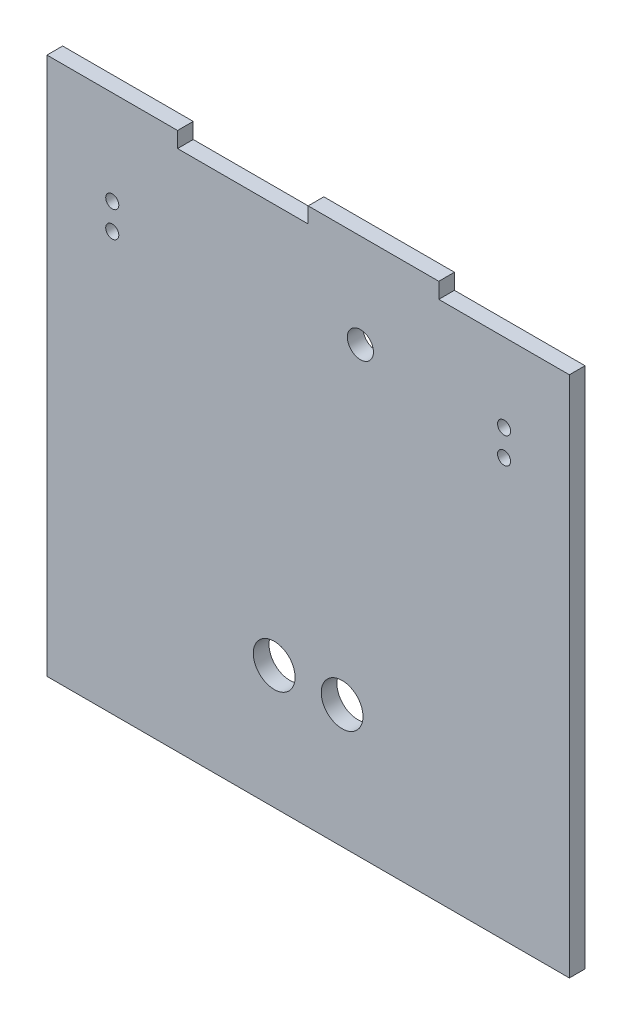
ISO-10303-21;
HEADER;
FILE_DESCRIPTION(('STEP AP214'),'2;1');
FILE_NAME('part.step','',(''),(''),'','','');
FILE_SCHEMA(('AUTOMOTIVE_DESIGN { 1 0 10303 214 1 1 1 1 }'));
ENDSEC;
DATA;
#1=APPLICATION_CONTEXT('core data for automotive mechanical design processes');
#2=APPLICATION_PROTOCOL_DEFINITION('international standard','automotive_design',2000,#1);
#3=PRODUCT_CONTEXT('',#1,'mechanical');
#4=PRODUCT('Part','Part','',(#3));
#5=PRODUCT_RELATED_PRODUCT_CATEGORY('part','',(#4));
#6=PRODUCT_DEFINITION_FORMATION('','',#4);
#7=PRODUCT_DEFINITION_CONTEXT('part definition',#1,'design');
#8=PRODUCT_DEFINITION('design','',#6,#7);
#9=PRODUCT_DEFINITION_SHAPE('','',#8);
#10=(LENGTH_UNIT() NAMED_UNIT(*) SI_UNIT(.MILLI.,.METRE.));
#11=(NAMED_UNIT(*) PLANE_ANGLE_UNIT() SI_UNIT($,.RADIAN.));
#12=(NAMED_UNIT(*) SI_UNIT($,.STERADIAN.) SOLID_ANGLE_UNIT());
#13=UNCERTAINTY_MEASURE_WITH_UNIT(LENGTH_MEASURE(1.E-05),#10,'distance_accuracy_value','');
#14=(GEOMETRIC_REPRESENTATION_CONTEXT(3) GLOBAL_UNCERTAINTY_ASSIGNED_CONTEXT((#13)) GLOBAL_UNIT_ASSIGNED_CONTEXT((#10,
#11,#12)) REPRESENTATION_CONTEXT('',''));
#15=CARTESIAN_POINT('',(0.,0.,0.));
#16=DIRECTION('',(0.,0.,1.));
#17=DIRECTION('',(1.,0.,0.));
#18=AXIS2_PLACEMENT_3D('',#15,#16,#17);
#19=CARTESIAN_POINT('',(0.,0.,6.));
#20=DIRECTION('',(0.,0.,1.));
#21=DIRECTION('',(1.,0.,0.));
#22=AXIS2_PLACEMENT_3D('',#19,#20,#21);
#23=PLANE('',#22);
#24=CARTESIAN_POINT('',(87.,47.149982819704,6.));
#25=DIRECTION('',(0.,0.,1.));
#26=DIRECTION('',(1.,0.,0.));
#27=AXIS2_PLACEMENT_3D('',#24,#25,#26);
#28=CIRCLE('',#27,8.);
#29=CARTESIAN_POINT('',(95.,47.149982819704,6.));
#30=VERTEX_POINT('',#29);
#31=EDGE_CURVE('E281',#30,#30,#28,.T.);
#32=ORIENTED_EDGE('',*,*,#31,.F.);
#33=EDGE_LOOP('',(#32));
#34=FACE_BOUND('',#33,.T.);
#35=CARTESIAN_POINT('',(25.,160.,6.));
#36=DIRECTION('',(0.,0.,1.));
#37=DIRECTION('',(1.,0.,0.));
#38=AXIS2_PLACEMENT_3D('',#35,#36,#37);
#39=CIRCLE('',#38,2.5);
#40=CARTESIAN_POINT('',(27.5,160.,6.));
#41=VERTEX_POINT('',#40);
#42=EDGE_CURVE('E265',#41,#41,#39,.T.);
#43=ORIENTED_EDGE('',*,*,#42,.F.);
#44=EDGE_LOOP('',(#43));
#45=FACE_BOUND('',#44,.T.);
#46=CARTESIAN_POINT('',(175.,160.,6.));
#47=DIRECTION('',(0.,0.,1.));
#48=DIRECTION('',(1.,0.,0.));
#49=AXIS2_PLACEMENT_3D('',#46,#47,#48);
#50=CIRCLE('',#49,2.5);
#51=CARTESIAN_POINT('',(177.5,160.,6.));
#52=VERTEX_POINT('',#51);
#53=EDGE_CURVE('E249',#52,#52,#50,.T.);
#54=ORIENTED_EDGE('',*,*,#53,.F.);
#55=EDGE_LOOP('',(#54));
#56=FACE_BOUND('',#55,.T.);
#57=DIRECTION('',(0.,-1.,0.));
#58=VECTOR('',#57,1.);
#59=CARTESIAN_POINT('',(0.,206.,6.));
#60=LINE('',#59,#58);
#61=CARTESIAN_POINT('',(0.,206.,6.));
#62=VERTEX_POINT('',#61);
#63=CARTESIAN_POINT('',(0.,0.,6.));
#64=VERTEX_POINT('',#63);
#65=EDGE_CURVE('E182',#62,#64,#60,.T.);
#66=ORIENTED_EDGE('',*,*,#65,.T.);
#67=DIRECTION('',(1.,0.,0.));
#68=VECTOR('',#67,1.);
#69=CARTESIAN_POINT('',(0.,0.,6.));
#70=LINE('',#69,#68);
#71=CARTESIAN_POINT('',(200.,0.,6.));
#72=VERTEX_POINT('',#71);
#73=EDGE_CURVE('E106',#64,#72,#70,.T.);
#74=ORIENTED_EDGE('',*,*,#73,.T.);
#75=DIRECTION('',(0.,1.,0.));
#76=VECTOR('',#75,1.);
#77=CARTESIAN_POINT('',(200.,0.,6.));
#78=LINE('',#77,#76);
#79=CARTESIAN_POINT('',(200.,200.,6.));
#80=VERTEX_POINT('',#79);
#81=EDGE_CURVE('E211',#72,#80,#78,.T.);
#82=ORIENTED_EDGE('',*,*,#81,.T.);
#83=DIRECTION('',(-1.,0.,0.));
#84=VECTOR('',#83,1.);
#85=CARTESIAN_POINT('',(200.,200.,6.));
#86=LINE('',#85,#84);
#87=CARTESIAN_POINT('',(150.,200.,6.));
#88=VERTEX_POINT('',#87);
#89=EDGE_CURVE('E231',#80,#88,#86,.T.);
#90=ORIENTED_EDGE('',*,*,#89,.T.);
#91=DIRECTION('',(0.,1.,0.));
#92=VECTOR('',#91,1.);
#93=CARTESIAN_POINT('',(150.,200.,6.));
#94=LINE('',#93,#92);
#95=CARTESIAN_POINT('',(150.,206.,6.));
#96=VERTEX_POINT('',#95);
#97=EDGE_CURVE('E227',#88,#96,#94,.T.);
#98=ORIENTED_EDGE('',*,*,#97,.T.);
#99=DIRECTION('',(-1.,0.,0.));
#100=VECTOR('',#99,1.);
#101=CARTESIAN_POINT('',(150.,206.,6.));
#102=LINE('',#101,#100);
#103=CARTESIAN_POINT('',(100.,206.,6.));
#104=VERTEX_POINT('',#103);
#105=EDGE_CURVE('E230',#96,#104,#102,.T.);
#106=ORIENTED_EDGE('',*,*,#105,.T.);
#107=DIRECTION('',(0.,-1.,0.));
#108=VECTOR('',#107,1.);
#109=CARTESIAN_POINT('',(100.,206.,6.));
#110=LINE('',#109,#108);
#111=CARTESIAN_POINT('',(100.,200.,6.));
#112=VERTEX_POINT('',#111);
#113=EDGE_CURVE('E131',#104,#112,#110,.T.);
#114=ORIENTED_EDGE('',*,*,#113,.T.);
#115=DIRECTION('',(-1.,0.,0.));
#116=VECTOR('',#115,1.);
#117=CARTESIAN_POINT('',(100.,200.,6.));
#118=LINE('',#117,#116);
#119=CARTESIAN_POINT('',(50.,200.,6.));
#120=VERTEX_POINT('',#119);
#121=EDGE_CURVE('E125',#112,#120,#118,.T.);
#122=ORIENTED_EDGE('',*,*,#121,.T.);
#123=DIRECTION('',(0.,1.,0.));
#124=VECTOR('',#123,1.);
#125=CARTESIAN_POINT('',(50.,200.,6.));
#126=LINE('',#125,#124);
#127=CARTESIAN_POINT('',(50.,206.,6.));
#128=VERTEX_POINT('',#127);
#129=EDGE_CURVE('E129',#120,#128,#126,.T.);
#130=ORIENTED_EDGE('',*,*,#129,.T.);
#131=DIRECTION('',(-1.,0.,0.));
#132=VECTOR('',#131,1.);
#133=CARTESIAN_POINT('',(50.,206.,6.));
#134=LINE('',#133,#132);
#135=EDGE_CURVE('E57',#128,#62,#134,.T.);
#136=ORIENTED_EDGE('',*,*,#135,.T.);
#137=EDGE_LOOP('',(#66,#74,#82,#90,#98,#106,#114,#122,#130,#136));
#138=FACE_BOUND('',#137,.T.);
#139=CARTESIAN_POINT('',(175.,170.,6.));
#140=DIRECTION('',(0.,0.,1.));
#141=DIRECTION('',(1.,0.,0.));
#142=AXIS2_PLACEMENT_3D('',#139,#140,#141);
#143=CIRCLE('',#142,2.5);
#144=CARTESIAN_POINT('',(177.5,170.,6.));
#145=VERTEX_POINT('',#144);
#146=EDGE_CURVE('E158',#145,#145,#143,.T.);
#147=ORIENTED_EDGE('',*,*,#146,.F.);
#148=EDGE_LOOP('',(#147));
#149=FACE_BOUND('',#148,.T.);
#150=CARTESIAN_POINT('',(25.,170.,6.));
#151=DIRECTION('',(0.,0.,1.));
#152=DIRECTION('',(1.,0.,0.));
#153=AXIS2_PLACEMENT_3D('',#150,#151,#152);
#154=CIRCLE('',#153,2.5);
#155=CARTESIAN_POINT('',(27.5,170.,6.));
#156=VERTEX_POINT('',#155);
#157=EDGE_CURVE('E257',#156,#156,#154,.T.);
#158=ORIENTED_EDGE('',*,*,#157,.F.);
#159=EDGE_LOOP('',(#158));
#160=FACE_BOUND('',#159,.T.);
#161=CARTESIAN_POINT('',(120.,170.,6.));
#162=DIRECTION('',(0.,0.,1.));
#163=DIRECTION('',(1.,0.,0.));
#164=AXIS2_PLACEMENT_3D('',#161,#162,#163);
#165=CIRCLE('',#164,5.00000000000002);
#166=CARTESIAN_POINT('',(125.,170.,6.));
#167=VERTEX_POINT('',#166);
#168=EDGE_CURVE('E273',#167,#167,#165,.T.);
#169=ORIENTED_EDGE('',*,*,#168,.F.);
#170=EDGE_LOOP('',(#169));
#171=FACE_BOUND('',#170,.T.);
#172=CARTESIAN_POINT('',(113.,47.149982819704,6.));
#173=DIRECTION('',(0.,0.,1.));
#174=DIRECTION('',(1.,0.,0.));
#175=AXIS2_PLACEMENT_3D('',#172,#173,#174);
#176=CIRCLE('',#175,8.);
#177=CARTESIAN_POINT('',(121.,47.149982819704,6.));
#178=VERTEX_POINT('',#177);
#179=EDGE_CURVE('E289',#178,#178,#176,.T.);
#180=ORIENTED_EDGE('',*,*,#179,.F.);
#181=EDGE_LOOP('',(#180));
#182=FACE_BOUND('',#181,.T.);
#183=ADVANCED_FACE('F39',(#34,#45,#56,#138,#149,#160,#171,#182),#23,.T.);
#184=CARTESIAN_POINT('',(0.,0.,0.));
#185=DIRECTION('',(0.,0.,1.));
#186=DIRECTION('',(1.,0.,0.));
#187=AXIS2_PLACEMENT_3D('',#184,#185,#186);
#188=PLANE('',#187);
#189=DIRECTION('',(0.,-1.,0.));
#190=VECTOR('',#189,1.);
#191=CARTESIAN_POINT('',(0.,206.,0.));
#192=LINE('',#191,#190);
#193=CARTESIAN_POINT('',(0.,206.,0.));
#194=VERTEX_POINT('',#193);
#195=CARTESIAN_POINT('',(0.,0.,0.));
#196=VERTEX_POINT('',#195);
#197=EDGE_CURVE('E153',#194,#196,#192,.T.);
#198=ORIENTED_EDGE('',*,*,#197,.F.);
#199=DIRECTION('',(-1.,0.,0.));
#200=VECTOR('',#199,1.);
#201=CARTESIAN_POINT('',(50.,206.,0.));
#202=LINE('',#201,#200);
#203=CARTESIAN_POINT('',(50.,206.,0.));
#204=VERTEX_POINT('',#203);
#205=EDGE_CURVE('E98',#204,#194,#202,.T.);
#206=ORIENTED_EDGE('',*,*,#205,.F.);
#207=DIRECTION('',(0.,1.,0.));
#208=VECTOR('',#207,1.);
#209=CARTESIAN_POINT('',(50.,200.,0.));
#210=LINE('',#209,#208);
#211=CARTESIAN_POINT('',(50.,200.,0.));
#212=VERTEX_POINT('',#211);
#213=EDGE_CURVE('E92',#212,#204,#210,.T.);
#214=ORIENTED_EDGE('',*,*,#213,.F.);
#215=DIRECTION('',(-1.,0.,0.));
#216=VECTOR('',#215,1.);
#217=CARTESIAN_POINT('',(100.,200.,0.));
#218=LINE('',#217,#216);
#219=CARTESIAN_POINT('',(100.,200.,0.));
#220=VERTEX_POINT('',#219);
#221=EDGE_CURVE('E140',#220,#212,#218,.T.);
#222=ORIENTED_EDGE('',*,*,#221,.F.);
#223=DIRECTION('',(0.,-1.,0.));
#224=VECTOR('',#223,1.);
#225=CARTESIAN_POINT('',(100.,206.,0.));
#226=LINE('',#225,#224);
#227=CARTESIAN_POINT('',(100.,206.,0.));
#228=VERTEX_POINT('',#227);
#229=EDGE_CURVE('E173',#228,#220,#226,.T.);
#230=ORIENTED_EDGE('',*,*,#229,.F.);
#231=DIRECTION('',(-1.,0.,0.));
#232=VECTOR('',#231,1.);
#233=CARTESIAN_POINT('',(150.,206.,0.));
#234=LINE('',#233,#232);
#235=CARTESIAN_POINT('',(150.,206.,0.));
#236=VERTEX_POINT('',#235);
#237=EDGE_CURVE('E170',#236,#228,#234,.T.);
#238=ORIENTED_EDGE('',*,*,#237,.F.);
#239=DIRECTION('',(0.,1.,0.));
#240=VECTOR('',#239,1.);
#241=CARTESIAN_POINT('',(150.,200.,0.));
#242=LINE('',#241,#240);
#243=CARTESIAN_POINT('',(150.,200.,0.));
#244=VERTEX_POINT('',#243);
#245=EDGE_CURVE('E167',#244,#236,#242,.T.);
#246=ORIENTED_EDGE('',*,*,#245,.F.);
#247=DIRECTION('',(-1.,0.,0.));
#248=VECTOR('',#247,1.);
#249=CARTESIAN_POINT('',(200.,200.,0.));
#250=LINE('',#249,#248);
#251=CARTESIAN_POINT('',(200.,200.,0.));
#252=VERTEX_POINT('',#251);
#253=EDGE_CURVE('E164',#252,#244,#250,.T.);
#254=ORIENTED_EDGE('',*,*,#253,.F.);
#255=DIRECTION('',(0.,1.,0.));
#256=VECTOR('',#255,1.);
#257=CARTESIAN_POINT('',(200.,0.,0.));
#258=LINE('',#257,#256);
#259=CARTESIAN_POINT('',(200.,0.,0.));
#260=VERTEX_POINT('',#259);
#261=EDGE_CURVE('E161',#260,#252,#258,.T.);
#262=ORIENTED_EDGE('',*,*,#261,.F.);
#263=DIRECTION('',(1.,0.,0.));
#264=VECTOR('',#263,1.);
#265=CARTESIAN_POINT('',(0.,0.,0.));
#266=LINE('',#265,#264);
#267=EDGE_CURVE('E157',#196,#260,#266,.T.);
#268=ORIENTED_EDGE('',*,*,#267,.F.);
#269=EDGE_LOOP('',(#198,#206,#214,#222,#230,#238,#246,#254,#262,#268));
#270=FACE_BOUND('',#269,.T.);
#271=CARTESIAN_POINT('',(175.,170.,0.));
#272=DIRECTION('',(0.,0.,1.));
#273=DIRECTION('',(1.,0.,0.));
#274=AXIS2_PLACEMENT_3D('',#271,#272,#273);
#275=CIRCLE('',#274,2.5);
#276=CARTESIAN_POINT('',(177.5,170.,0.));
#277=VERTEX_POINT('',#276);
#278=EDGE_CURVE('E245',#277,#277,#275,.T.);
#279=ORIENTED_EDGE('',*,*,#278,.T.);
#280=EDGE_LOOP('',(#279));
#281=FACE_BOUND('',#280,.T.);
#282=CARTESIAN_POINT('',(175.,160.,0.));
#283=DIRECTION('',(0.,0.,1.));
#284=DIRECTION('',(1.,0.,0.));
#285=AXIS2_PLACEMENT_3D('',#282,#283,#284);
#286=CIRCLE('',#285,2.5);
#287=CARTESIAN_POINT('',(177.5,160.,0.));
#288=VERTEX_POINT('',#287);
#289=EDGE_CURVE('E253',#288,#288,#286,.T.);
#290=ORIENTED_EDGE('',*,*,#289,.T.);
#291=EDGE_LOOP('',(#290));
#292=FACE_BOUND('',#291,.T.);
#293=CARTESIAN_POINT('',(25.,170.,0.));
#294=DIRECTION('',(0.,0.,1.));
#295=DIRECTION('',(1.,0.,0.));
#296=AXIS2_PLACEMENT_3D('',#293,#294,#295);
#297=CIRCLE('',#296,2.5);
#298=CARTESIAN_POINT('',(27.5,170.,0.));
#299=VERTEX_POINT('',#298);
#300=EDGE_CURVE('E261',#299,#299,#297,.T.);
#301=ORIENTED_EDGE('',*,*,#300,.T.);
#302=EDGE_LOOP('',(#301));
#303=FACE_BOUND('',#302,.T.);
#304=CARTESIAN_POINT('',(25.,160.,0.));
#305=DIRECTION('',(0.,0.,1.));
#306=DIRECTION('',(1.,0.,0.));
#307=AXIS2_PLACEMENT_3D('',#304,#305,#306);
#308=CIRCLE('',#307,2.5);
#309=CARTESIAN_POINT('',(27.5,160.,0.));
#310=VERTEX_POINT('',#309);
#311=EDGE_CURVE('E269',#310,#310,#308,.T.);
#312=ORIENTED_EDGE('',*,*,#311,.T.);
#313=EDGE_LOOP('',(#312));
#314=FACE_BOUND('',#313,.T.);
#315=CARTESIAN_POINT('',(120.,170.,0.));
#316=DIRECTION('',(0.,0.,1.));
#317=DIRECTION('',(1.,0.,0.));
#318=AXIS2_PLACEMENT_3D('',#315,#316,#317);
#319=CIRCLE('',#318,5.00000000000002);
#320=CARTESIAN_POINT('',(125.,170.,0.));
#321=VERTEX_POINT('',#320);
#322=EDGE_CURVE('E277',#321,#321,#319,.T.);
#323=ORIENTED_EDGE('',*,*,#322,.T.);
#324=EDGE_LOOP('',(#323));
#325=FACE_BOUND('',#324,.T.);
#326=CARTESIAN_POINT('',(87.,47.149982819704,0.));
#327=DIRECTION('',(0.,0.,1.));
#328=DIRECTION('',(1.,0.,0.));
#329=AXIS2_PLACEMENT_3D('',#326,#327,#328);
#330=CIRCLE('',#329,8.);
#331=CARTESIAN_POINT('',(95.,47.149982819704,0.));
#332=VERTEX_POINT('',#331);
#333=EDGE_CURVE('E285',#332,#332,#330,.T.);
#334=ORIENTED_EDGE('',*,*,#333,.T.);
#335=EDGE_LOOP('',(#334));
#336=FACE_BOUND('',#335,.T.);
#337=CARTESIAN_POINT('',(113.,47.149982819704,0.));
#338=DIRECTION('',(0.,0.,1.));
#339=DIRECTION('',(1.,0.,0.));
#340=AXIS2_PLACEMENT_3D('',#337,#338,#339);
#341=CIRCLE('',#340,8.);
#342=CARTESIAN_POINT('',(121.,47.149982819704,0.));
#343=VERTEX_POINT('',#342);
#344=EDGE_CURVE('E293',#343,#343,#341,.T.);
#345=ORIENTED_EDGE('',*,*,#344,.T.);
#346=EDGE_LOOP('',(#345));
#347=FACE_BOUND('',#346,.T.);
#348=ADVANCED_FACE('F215',(#270,#281,#292,#303,#314,#325,#336,#347),#188,.F.);
#349=CARTESIAN_POINT('',(0.,206.,6.));
#350=DIRECTION('',(1.,0.,0.));
#351=DIRECTION('',(0.,0.,-1.));
#352=AXIS2_PLACEMENT_3D('',#349,#350,#351);
#353=PLANE('',#352);
#354=ORIENTED_EDGE('',*,*,#197,.T.);
#355=DIRECTION('',(0.,0.,-1.));
#356=VECTOR('',#355,1.);
#357=CARTESIAN_POINT('',(0.,0.,6.));
#358=LINE('',#357,#356);
#359=EDGE_CURVE('E11',#64,#196,#358,.T.);
#360=ORIENTED_EDGE('',*,*,#359,.F.);
#361=ORIENTED_EDGE('',*,*,#65,.F.);
#362=DIRECTION('',(0.,0.,-1.));
#363=VECTOR('',#362,1.);
#364=CARTESIAN_POINT('',(0.,206.,6.));
#365=LINE('',#364,#363);
#366=EDGE_CURVE('E149',#62,#194,#365,.T.);
#367=ORIENTED_EDGE('',*,*,#366,.T.);
#368=EDGE_LOOP('',(#354,#360,#361,#367));
#369=FACE_BOUND('',#368,.T.);
#370=ADVANCED_FACE('F41',(#369),#353,.F.);
#371=CARTESIAN_POINT('',(0.,0.,6.));
#372=DIRECTION('',(0.,1.,0.));
#373=DIRECTION('',(0.,0.,1.));
#374=AXIS2_PLACEMENT_3D('',#371,#372,#373);
#375=PLANE('',#374);
#376=ORIENTED_EDGE('',*,*,#267,.T.);
#377=DIRECTION('',(0.,0.,-1.));
#378=VECTOR('',#377,1.);
#379=CARTESIAN_POINT('',(200.,0.,6.));
#380=LINE('',#379,#378);
#381=EDGE_CURVE('E49',#72,#260,#380,.T.);
#382=ORIENTED_EDGE('',*,*,#381,.F.);
#383=ORIENTED_EDGE('',*,*,#73,.F.);
#384=ORIENTED_EDGE('',*,*,#359,.T.);
#385=EDGE_LOOP('',(#376,#382,#383,#384));
#386=FACE_BOUND('',#385,.T.);
#387=ADVANCED_FACE('F337',(#386),#375,.F.);
#388=CARTESIAN_POINT('',(200.,0.,6.));
#389=DIRECTION('',(-1.,0.,0.));
#390=DIRECTION('',(0.,-1.,0.));
#391=AXIS2_PLACEMENT_3D('',#388,#389,#390);
#392=PLANE('',#391);
#393=ORIENTED_EDGE('',*,*,#261,.T.);
#394=DIRECTION('',(0.,0.,-1.));
#395=VECTOR('',#394,1.);
#396=CARTESIAN_POINT('',(200.,200.,6.));
#397=LINE('',#396,#395);
#398=EDGE_CURVE('E201',#80,#252,#397,.T.);
#399=ORIENTED_EDGE('',*,*,#398,.F.);
#400=ORIENTED_EDGE('',*,*,#81,.F.);
#401=ORIENTED_EDGE('',*,*,#381,.T.);
#402=EDGE_LOOP('',(#393,#399,#400,#401));
#403=FACE_BOUND('',#402,.T.);
#404=ADVANCED_FACE('F209',(#403),#392,.F.);
#405=CARTESIAN_POINT('',(200.,200.,6.));
#406=DIRECTION('',(0.,-1.,0.));
#407=DIRECTION('',(0.,0.,-1.));
#408=AXIS2_PLACEMENT_3D('',#405,#406,#407);
#409=PLANE('',#408);
#410=ORIENTED_EDGE('',*,*,#253,.T.);
#411=DIRECTION('',(0.,0.,-1.));
#412=VECTOR('',#411,1.);
#413=CARTESIAN_POINT('',(150.,200.,6.));
#414=LINE('',#413,#412);
#415=EDGE_CURVE('E197',#88,#244,#414,.T.);
#416=ORIENTED_EDGE('',*,*,#415,.F.);
#417=ORIENTED_EDGE('',*,*,#89,.F.);
#418=ORIENTED_EDGE('',*,*,#398,.T.);
#419=EDGE_LOOP('',(#410,#416,#417,#418));
#420=FACE_BOUND('',#419,.T.);
#421=ADVANCED_FACE('F221',(#420),#409,.F.);
#422=CARTESIAN_POINT('',(150.,200.,6.));
#423=DIRECTION('',(-1.,0.,0.));
#424=DIRECTION('',(0.,0.,1.));
#425=AXIS2_PLACEMENT_3D('',#422,#423,#424);
#426=PLANE('',#425);
#427=ORIENTED_EDGE('',*,*,#245,.T.);
#428=DIRECTION('',(0.,0.,-1.));
#429=VECTOR('',#428,1.);
#430=CARTESIAN_POINT('',(150.,206.,6.));
#431=LINE('',#430,#429);
#432=EDGE_CURVE('E193',#96,#236,#431,.T.);
#433=ORIENTED_EDGE('',*,*,#432,.F.);
#434=ORIENTED_EDGE('',*,*,#97,.F.);
#435=ORIENTED_EDGE('',*,*,#415,.T.);
#436=EDGE_LOOP('',(#427,#433,#434,#435));
#437=FACE_BOUND('',#436,.T.);
#438=ADVANCED_FACE('F225',(#437),#426,.F.);
#439=CARTESIAN_POINT('',(150.,206.,6.));
#440=DIRECTION('',(0.,-1.,0.));
#441=DIRECTION('',(0.,0.,-1.));
#442=AXIS2_PLACEMENT_3D('',#439,#440,#441);
#443=PLANE('',#442);
#444=ORIENTED_EDGE('',*,*,#237,.T.);
#445=DIRECTION('',(0.,0.,-1.));
#446=VECTOR('',#445,1.);
#447=CARTESIAN_POINT('',(100.,206.,6.));
#448=LINE('',#447,#446);
#449=EDGE_CURVE('E189',#104,#228,#448,.T.);
#450=ORIENTED_EDGE('',*,*,#449,.F.);
#451=ORIENTED_EDGE('',*,*,#105,.F.);
#452=ORIENTED_EDGE('',*,*,#432,.T.);
#453=EDGE_LOOP('',(#444,#450,#451,#452));
#454=FACE_BOUND('',#453,.T.);
#455=ADVANCED_FACE('F327',(#454),#443,.F.);
#456=CARTESIAN_POINT('',(100.,206.,6.));
#457=DIRECTION('',(1.,0.,0.));
#458=DIRECTION('',(0.,0.,-1.));
#459=AXIS2_PLACEMENT_3D('',#456,#457,#458);
#460=PLANE('',#459);
#461=ORIENTED_EDGE('',*,*,#229,.T.);
#462=DIRECTION('',(0.,0.,-1.));
#463=VECTOR('',#462,1.);
#464=CARTESIAN_POINT('',(100.,200.,6.));
#465=LINE('',#464,#463);
#466=EDGE_CURVE('E142',#112,#220,#465,.T.);
#467=ORIENTED_EDGE('',*,*,#466,.F.);
#468=ORIENTED_EDGE('',*,*,#113,.F.);
#469=ORIENTED_EDGE('',*,*,#449,.T.);
#470=EDGE_LOOP('',(#461,#467,#468,#469));
#471=FACE_BOUND('',#470,.T.);
#472=ADVANCED_FACE('F324',(#471),#460,.F.);
#473=CARTESIAN_POINT('',(100.,200.,6.));
#474=DIRECTION('',(0.,-1.,0.));
#475=DIRECTION('',(1.,0.,0.));
#476=AXIS2_PLACEMENT_3D('',#473,#474,#475);
#477=PLANE('',#476);
#478=ORIENTED_EDGE('',*,*,#221,.T.);
#479=DIRECTION('',(0.,0.,-1.));
#480=VECTOR('',#479,1.);
#481=CARTESIAN_POINT('',(50.,200.,6.));
#482=LINE('',#481,#480);
#483=EDGE_CURVE('E137',#120,#212,#482,.T.);
#484=ORIENTED_EDGE('',*,*,#483,.F.);
#485=ORIENTED_EDGE('',*,*,#121,.F.);
#486=ORIENTED_EDGE('',*,*,#466,.T.);
#487=EDGE_LOOP('',(#478,#484,#485,#486));
#488=FACE_BOUND('',#487,.T.);
#489=ADVANCED_FACE('F138',(#488),#477,.F.);
#490=CARTESIAN_POINT('',(50.,200.,6.));
#491=DIRECTION('',(-1.,0.,0.));
#492=DIRECTION('',(0.,0.,1.));
#493=AXIS2_PLACEMENT_3D('',#490,#491,#492);
#494=PLANE('',#493);
#495=ORIENTED_EDGE('',*,*,#213,.T.);
#496=DIRECTION('',(0.,0.,-1.));
#497=VECTOR('',#496,1.);
#498=CARTESIAN_POINT('',(50.,206.,6.));
#499=LINE('',#498,#497);
#500=EDGE_CURVE('E143',#128,#204,#499,.T.);
#501=ORIENTED_EDGE('',*,*,#500,.F.);
#502=ORIENTED_EDGE('',*,*,#129,.F.);
#503=ORIENTED_EDGE('',*,*,#483,.T.);
#504=EDGE_LOOP('',(#495,#501,#502,#503));
#505=FACE_BOUND('',#504,.T.);
#506=ADVANCED_FACE('F145',(#505),#494,.F.);
#507=CARTESIAN_POINT('',(50.,206.,6.));
#508=DIRECTION('',(0.,-1.,0.));
#509=DIRECTION('',(0.,0.,-1.));
#510=AXIS2_PLACEMENT_3D('',#507,#508,#509);
#511=PLANE('',#510);
#512=ORIENTED_EDGE('',*,*,#205,.T.);
#513=ORIENTED_EDGE('',*,*,#366,.F.);
#514=ORIENTED_EDGE('',*,*,#135,.F.);
#515=ORIENTED_EDGE('',*,*,#500,.T.);
#516=EDGE_LOOP('',(#512,#513,#514,#515));
#517=FACE_BOUND('',#516,.T.);
#518=ADVANCED_FACE('F317',(#517),#511,.F.);
#519=CARTESIAN_POINT('',(175.,170.,6.));
#520=DIRECTION('',(0.,0.,-1.));
#521=DIRECTION('',(-1.,0.,0.));
#522=AXIS2_PLACEMENT_3D('',#519,#520,#521);
#523=CYLINDRICAL_SURFACE('',#522,2.5);
#524=ORIENTED_EDGE('',*,*,#146,.T.);
#525=EDGE_LOOP('',(#524));
#526=FACE_BOUND('',#525,.T.);
#527=ORIENTED_EDGE('',*,*,#278,.F.);
#528=EDGE_LOOP('',(#527));
#529=FACE_BOUND('',#528,.T.);
#530=ADVANCED_FACE('F314',(#526,#529),#523,.F.);
#531=CARTESIAN_POINT('',(175.,160.,6.));
#532=DIRECTION('',(0.,0.,-1.));
#533=DIRECTION('',(-1.,0.,0.));
#534=AXIS2_PLACEMENT_3D('',#531,#532,#533);
#535=CYLINDRICAL_SURFACE('',#534,2.5);
#536=ORIENTED_EDGE('',*,*,#53,.T.);
#537=EDGE_LOOP('',(#536));
#538=FACE_BOUND('',#537,.T.);
#539=ORIENTED_EDGE('',*,*,#289,.F.);
#540=EDGE_LOOP('',(#539));
#541=FACE_BOUND('',#540,.T.);
#542=ADVANCED_FACE('F413',(#538,#541),#535,.F.);
#543=CARTESIAN_POINT('',(25.,170.,6.));
#544=DIRECTION('',(0.,0.,-1.));
#545=DIRECTION('',(-1.,0.,0.));
#546=AXIS2_PLACEMENT_3D('',#543,#544,#545);
#547=CYLINDRICAL_SURFACE('',#546,2.5);
#548=ORIENTED_EDGE('',*,*,#157,.T.);
#549=EDGE_LOOP('',(#548));
#550=FACE_BOUND('',#549,.T.);
#551=ORIENTED_EDGE('',*,*,#300,.F.);
#552=EDGE_LOOP('',(#551));
#553=FACE_BOUND('',#552,.T.);
#554=ADVANCED_FACE('F421',(#550,#553),#547,.F.);
#555=CARTESIAN_POINT('',(25.,160.,6.));
#556=DIRECTION('',(0.,0.,-1.));
#557=DIRECTION('',(-1.,0.,0.));
#558=AXIS2_PLACEMENT_3D('',#555,#556,#557);
#559=CYLINDRICAL_SURFACE('',#558,2.5);
#560=ORIENTED_EDGE('',*,*,#42,.T.);
#561=EDGE_LOOP('',(#560));
#562=FACE_BOUND('',#561,.T.);
#563=ORIENTED_EDGE('',*,*,#311,.F.);
#564=EDGE_LOOP('',(#563));
#565=FACE_BOUND('',#564,.T.);
#566=ADVANCED_FACE('F429',(#562,#565),#559,.F.);
#567=CARTESIAN_POINT('',(120.,170.,6.));
#568=DIRECTION('',(0.,0.,-1.));
#569=DIRECTION('',(-1.,0.,0.));
#570=AXIS2_PLACEMENT_3D('',#567,#568,#569);
#571=CYLINDRICAL_SURFACE('',#570,5.00000000000002);
#572=ORIENTED_EDGE('',*,*,#168,.T.);
#573=EDGE_LOOP('',(#572));
#574=FACE_BOUND('',#573,.T.);
#575=ORIENTED_EDGE('',*,*,#322,.F.);
#576=EDGE_LOOP('',(#575));
#577=FACE_BOUND('',#576,.T.);
#578=ADVANCED_FACE('F438',(#574,#577),#571,.F.);
#579=CARTESIAN_POINT('',(87.,47.149982819704,6.));
#580=DIRECTION('',(0.,0.,-1.));
#581=DIRECTION('',(-1.,0.,0.));
#582=AXIS2_PLACEMENT_3D('',#579,#580,#581);
#583=CYLINDRICAL_SURFACE('',#582,8.);
#584=ORIENTED_EDGE('',*,*,#31,.T.);
#585=EDGE_LOOP('',(#584));
#586=FACE_BOUND('',#585,.T.);
#587=ORIENTED_EDGE('',*,*,#333,.F.);
#588=EDGE_LOOP('',(#587));
#589=FACE_BOUND('',#588,.T.);
#590=ADVANCED_FACE('F447',(#586,#589),#583,.F.);
#591=CARTESIAN_POINT('',(113.,47.149982819704,6.));
#592=DIRECTION('',(0.,0.,-1.));
#593=DIRECTION('',(-1.,0.,0.));
#594=AXIS2_PLACEMENT_3D('',#591,#592,#593);
#595=CYLINDRICAL_SURFACE('',#594,8.);
#596=ORIENTED_EDGE('',*,*,#179,.T.);
#597=EDGE_LOOP('',(#596));
#598=FACE_BOUND('',#597,.T.);
#599=ORIENTED_EDGE('',*,*,#344,.F.);
#600=EDGE_LOOP('',(#599));
#601=FACE_BOUND('',#600,.T.);
#602=ADVANCED_FACE('F301',(#598,#601),#595,.F.);
#603=CLOSED_SHELL('',(#183,#348,#370,#387,#404,#421,#438,#455,#472,#489,#506,#518,#530,#542,
#554,#566,#578,#590,#602));
#604=MANIFOLD_SOLID_BREP('B2',#603);
#605=ADVANCED_BREP_SHAPE_REPRESENTATION('',(#18,#604),#14);
#606=SHAPE_DEFINITION_REPRESENTATION(#9,#605);
ENDSEC;
END-ISO-10303-21;
